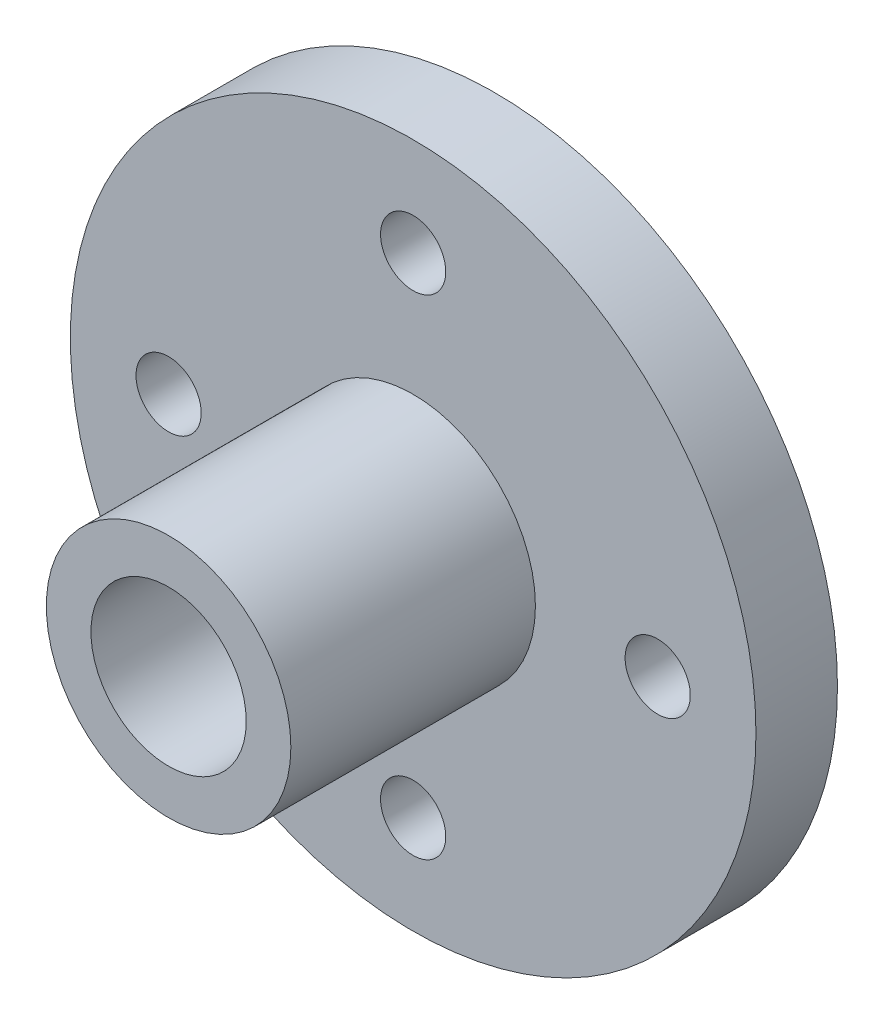
ISO-10303-21;
HEADER;
FILE_DESCRIPTION(('STEP AP214'),'2;1');
FILE_NAME('part.step','',(''),(''),'','','');
FILE_SCHEMA(('AUTOMOTIVE_DESIGN { 1 0 10303 214 1 1 1 1 }'));
ENDSEC;
DATA;
#1=APPLICATION_CONTEXT('core data for automotive mechanical design processes');
#2=APPLICATION_PROTOCOL_DEFINITION('international standard','automotive_design',2000,#1);
#3=PRODUCT_CONTEXT('',#1,'mechanical');
#4=PRODUCT('Part','Part','',(#3));
#5=PRODUCT_RELATED_PRODUCT_CATEGORY('part','',(#4));
#6=PRODUCT_DEFINITION_FORMATION('','',#4);
#7=PRODUCT_DEFINITION_CONTEXT('part definition',#1,'design');
#8=PRODUCT_DEFINITION('design','',#6,#7);
#9=PRODUCT_DEFINITION_SHAPE('','',#8);
#10=(LENGTH_UNIT() NAMED_UNIT(*) SI_UNIT(.MILLI.,.METRE.));
#11=(NAMED_UNIT(*) PLANE_ANGLE_UNIT() SI_UNIT($,.RADIAN.));
#12=(NAMED_UNIT(*) SI_UNIT($,.STERADIAN.) SOLID_ANGLE_UNIT());
#13=UNCERTAINTY_MEASURE_WITH_UNIT(LENGTH_MEASURE(1.E-05),#10,'distance_accuracy_value','');
#14=(GEOMETRIC_REPRESENTATION_CONTEXT(3) GLOBAL_UNCERTAINTY_ASSIGNED_CONTEXT((#13)) GLOBAL_UNIT_ASSIGNED_CONTEXT((#10,
#11,#12)) REPRESENTATION_CONTEXT('',''));
#15=CARTESIAN_POINT('',(0.,0.,0.));
#16=DIRECTION('',(0.,0.,1.));
#17=DIRECTION('',(1.,0.,0.));
#18=AXIS2_PLACEMENT_3D('',#15,#16,#17);
#19=CARTESIAN_POINT('',(0.,0.,5.));
#20=DIRECTION('',(0.,0.,1.));
#21=DIRECTION('',(1.,0.,0.));
#22=AXIS2_PLACEMENT_3D('',#19,#20,#21);
#23=PLANE('',#22);
#24=CARTESIAN_POINT('',(0.,0.,5.));
#25=DIRECTION('',(0.,0.,1.));
#26=DIRECTION('',(1.,0.,0.));
#27=AXIS2_PLACEMENT_3D('',#24,#25,#26);
#28=CIRCLE('',#27,15.);
#29=CARTESIAN_POINT('',(15.,0.,5.));
#30=VERTEX_POINT('',#29);
#31=EDGE_CURVE('E88',#30,#30,#28,.T.);
#32=ORIENTED_EDGE('',*,*,#31,.F.);
#33=EDGE_LOOP('',(#32));
#34=FACE_BOUND('',#33,.T.);
#35=CARTESIAN_POINT('',(0.,-30.,5.));
#36=DIRECTION('',(0.,0.,1.));
#37=DIRECTION('',(-1.,0.,0.));
#38=AXIS2_PLACEMENT_3D('',#35,#36,#37);
#39=CIRCLE('',#38,3.99999999999995);
#40=CARTESIAN_POINT('',(-3.99999999999994,-30.,5.));
#41=VERTEX_POINT('',#40);
#42=EDGE_CURVE('E68',#41,#41,#39,.T.);
#43=ORIENTED_EDGE('',*,*,#42,.F.);
#44=EDGE_LOOP('',(#43));
#45=FACE_BOUND('',#44,.T.);
#46=CARTESIAN_POINT('',(0.,30.,5.));
#47=DIRECTION('',(0.,0.,1.));
#48=DIRECTION('',(1.,0.,0.));
#49=AXIS2_PLACEMENT_3D('',#46,#47,#48);
#50=CIRCLE('',#49,4.);
#51=CARTESIAN_POINT('',(4.00000000000001,30.,5.));
#52=VERTEX_POINT('',#51);
#53=EDGE_CURVE('E55',#52,#52,#50,.T.);
#54=ORIENTED_EDGE('',*,*,#53,.F.);
#55=EDGE_LOOP('',(#54));
#56=FACE_BOUND('',#55,.T.);
#57=CARTESIAN_POINT('',(0.,0.,5.));
#58=DIRECTION('',(0.,0.,1.));
#59=DIRECTION('',(1.,0.,0.));
#60=AXIS2_PLACEMENT_3D('',#57,#58,#59);
#61=CIRCLE('',#60,42.055);
#62=CARTESIAN_POINT('',(42.055,0.,5.));
#63=VERTEX_POINT('',#62);
#64=EDGE_CURVE('E10',#63,#63,#61,.T.);
#65=ORIENTED_EDGE('',*,*,#64,.T.);
#66=EDGE_LOOP('',(#65));
#67=FACE_BOUND('',#66,.T.);
#68=CARTESIAN_POINT('',(-30.,0.,5.));
#69=DIRECTION('',(0.,0.,1.));
#70=DIRECTION('',(1.,0.,0.));
#71=AXIS2_PLACEMENT_3D('',#68,#69,#70);
#72=CIRCLE('',#71,4.);
#73=CARTESIAN_POINT('',(-26.,0.,5.));
#74=VERTEX_POINT('',#73);
#75=EDGE_CURVE('E60',#74,#74,#72,.T.);
#76=ORIENTED_EDGE('',*,*,#75,.F.);
#77=EDGE_LOOP('',(#76));
#78=FACE_BOUND('',#77,.T.);
#79=CARTESIAN_POINT('',(30.,0.,5.));
#80=DIRECTION('',(0.,0.,1.));
#81=DIRECTION('',(-1.,0.,0.));
#82=AXIS2_PLACEMENT_3D('',#79,#80,#81);
#83=CIRCLE('',#82,4.);
#84=CARTESIAN_POINT('',(26.,0.,5.));
#85=VERTEX_POINT('',#84);
#86=EDGE_CURVE('E76',#85,#85,#83,.T.);
#87=ORIENTED_EDGE('',*,*,#86,.F.);
#88=EDGE_LOOP('',(#87));
#89=FACE_BOUND('',#88,.T.);
#90=ADVANCED_FACE('F37',(#34,#45,#56,#67,#78,#89),#23,.T.);
#91=CARTESIAN_POINT('',(0.,0.,-5.));
#92=DIRECTION('',(0.,0.,1.));
#93=DIRECTION('',(1.,0.,0.));
#94=AXIS2_PLACEMENT_3D('',#91,#92,#93);
#95=PLANE('',#94);
#96=CARTESIAN_POINT('',(0.,0.,-5.));
#97=DIRECTION('',(0.,0.,1.));
#98=DIRECTION('',(1.,0.,0.));
#99=AXIS2_PLACEMENT_3D('',#96,#97,#98);
#100=CIRCLE('',#99,42.055);
#101=CARTESIAN_POINT('',(42.055,0.,-5.));
#102=VERTEX_POINT('',#101);
#103=EDGE_CURVE('E41',#102,#102,#100,.T.);
#104=ORIENTED_EDGE('',*,*,#103,.F.);
#105=EDGE_LOOP('',(#104));
#106=FACE_BOUND('',#105,.T.);
#107=CARTESIAN_POINT('',(0.,0.,-5.));
#108=DIRECTION('',(0.,0.,1.));
#109=DIRECTION('',(1.,0.,0.));
#110=AXIS2_PLACEMENT_3D('',#107,#108,#109);
#111=CIRCLE('',#110,9.525);
#112=CARTESIAN_POINT('',(9.525,0.,-5.));
#113=VERTEX_POINT('',#112);
#114=EDGE_CURVE('E50',#113,#113,#111,.T.);
#115=ORIENTED_EDGE('',*,*,#114,.T.);
#116=EDGE_LOOP('',(#115));
#117=FACE_BOUND('',#116,.T.);
#118=CARTESIAN_POINT('',(0.,30.,-5.));
#119=DIRECTION('',(0.,0.,1.));
#120=DIRECTION('',(1.,0.,0.));
#121=AXIS2_PLACEMENT_3D('',#118,#119,#120);
#122=CIRCLE('',#121,4.);
#123=CARTESIAN_POINT('',(4.00000000000001,30.,-5.));
#124=VERTEX_POINT('',#123);
#125=EDGE_CURVE('E56',#124,#124,#122,.T.);
#126=ORIENTED_EDGE('',*,*,#125,.T.);
#127=EDGE_LOOP('',(#126));
#128=FACE_BOUND('',#127,.T.);
#129=CARTESIAN_POINT('',(-30.,0.,-5.));
#130=DIRECTION('',(0.,0.,1.));
#131=DIRECTION('',(1.,0.,0.));
#132=AXIS2_PLACEMENT_3D('',#129,#130,#131);
#133=CIRCLE('',#132,4.);
#134=CARTESIAN_POINT('',(-26.,0.,-5.));
#135=VERTEX_POINT('',#134);
#136=EDGE_CURVE('E64',#135,#135,#133,.T.);
#137=ORIENTED_EDGE('',*,*,#136,.T.);
#138=EDGE_LOOP('',(#137));
#139=FACE_BOUND('',#138,.T.);
#140=CARTESIAN_POINT('',(0.,-30.,-5.));
#141=DIRECTION('',(0.,0.,1.));
#142=DIRECTION('',(-1.,0.,0.));
#143=AXIS2_PLACEMENT_3D('',#140,#141,#142);
#144=CIRCLE('',#143,3.99999999999995);
#145=CARTESIAN_POINT('',(-3.99999999999994,-30.,-5.));
#146=VERTEX_POINT('',#145);
#147=EDGE_CURVE('E72',#146,#146,#144,.T.);
#148=ORIENTED_EDGE('',*,*,#147,.T.);
#149=EDGE_LOOP('',(#148));
#150=FACE_BOUND('',#149,.T.);
#151=CARTESIAN_POINT('',(30.,0.,-5.));
#152=DIRECTION('',(0.,0.,1.));
#153=DIRECTION('',(-1.,0.,0.));
#154=AXIS2_PLACEMENT_3D('',#151,#152,#153);
#155=CIRCLE('',#154,4.);
#156=CARTESIAN_POINT('',(26.,0.,-5.));
#157=VERTEX_POINT('',#156);
#158=EDGE_CURVE('E80',#157,#157,#155,.T.);
#159=ORIENTED_EDGE('',*,*,#158,.T.);
#160=EDGE_LOOP('',(#159));
#161=FACE_BOUND('',#160,.T.);
#162=ADVANCED_FACE('F117',(#106,#117,#128,#139,#150,#161),#95,.F.);
#163=CARTESIAN_POINT('',(0.,0.,5.));
#164=DIRECTION('',(0.,0.,-1.));
#165=DIRECTION('',(-1.,0.,0.));
#166=AXIS2_PLACEMENT_3D('',#163,#164,#165);
#167=CYLINDRICAL_SURFACE('',#166,42.055);
#168=ORIENTED_EDGE('',*,*,#64,.F.);
#169=EDGE_LOOP('',(#168));
#170=FACE_BOUND('',#169,.T.);
#171=ORIENTED_EDGE('',*,*,#103,.T.);
#172=EDGE_LOOP('',(#171));
#173=FACE_BOUND('',#172,.T.);
#174=ADVANCED_FACE('F39',(#170,#173),#167,.T.);
#175=CARTESIAN_POINT('',(0.,0.,5.));
#176=DIRECTION('',(0.,0.,-1.));
#177=DIRECTION('',(-1.,0.,0.));
#178=AXIS2_PLACEMENT_3D('',#175,#176,#177);
#179=CYLINDRICAL_SURFACE('',#178,9.525);
#180=ORIENTED_EDGE('',*,*,#114,.F.);
#181=EDGE_LOOP('',(#180));
#182=FACE_BOUND('',#181,.T.);
#183=CARTESIAN_POINT('',(0.,0.,35.));
#184=DIRECTION('',(0.,0.,1.));
#185=DIRECTION('',(1.,0.,0.));
#186=AXIS2_PLACEMENT_3D('',#183,#184,#185);
#187=CIRCLE('',#186,9.525);
#188=CARTESIAN_POINT('',(9.525,0.,35.));
#189=VERTEX_POINT('',#188);
#190=EDGE_CURVE('E92',#189,#189,#187,.T.);
#191=ORIENTED_EDGE('',*,*,#190,.T.);
#192=EDGE_LOOP('',(#191));
#193=FACE_BOUND('',#192,.T.);
#194=ADVANCED_FACE('F100',(#182,#193),#179,.F.);
#195=CARTESIAN_POINT('',(0.,30.,5.));
#196=DIRECTION('',(0.,0.,-1.));
#197=DIRECTION('',(-1.,0.,0.));
#198=AXIS2_PLACEMENT_3D('',#195,#196,#197);
#199=CYLINDRICAL_SURFACE('',#198,4.);
#200=ORIENTED_EDGE('',*,*,#53,.T.);
#201=EDGE_LOOP('',(#200));
#202=FACE_BOUND('',#201,.T.);
#203=ORIENTED_EDGE('',*,*,#125,.F.);
#204=EDGE_LOOP('',(#203));
#205=FACE_BOUND('',#204,.T.);
#206=ADVANCED_FACE('F144',(#202,#205),#199,.F.);
#207=CARTESIAN_POINT('',(-30.,0.,5.));
#208=DIRECTION('',(0.,0.,-1.));
#209=DIRECTION('',(-1.,0.,0.));
#210=AXIS2_PLACEMENT_3D('',#207,#208,#209);
#211=CYLINDRICAL_SURFACE('',#210,4.);
#212=ORIENTED_EDGE('',*,*,#75,.T.);
#213=EDGE_LOOP('',(#212));
#214=FACE_BOUND('',#213,.T.);
#215=ORIENTED_EDGE('',*,*,#136,.F.);
#216=EDGE_LOOP('',(#215));
#217=FACE_BOUND('',#216,.T.);
#218=ADVANCED_FACE('F148',(#214,#217),#211,.F.);
#219=CARTESIAN_POINT('',(0.,-30.,5.));
#220=DIRECTION('',(0.,0.,-1.));
#221=DIRECTION('',(-1.,0.,0.));
#222=AXIS2_PLACEMENT_3D('',#219,#220,#221);
#223=CYLINDRICAL_SURFACE('',#222,3.99999999999995);
#224=ORIENTED_EDGE('',*,*,#42,.T.);
#225=EDGE_LOOP('',(#224));
#226=FACE_BOUND('',#225,.T.);
#227=ORIENTED_EDGE('',*,*,#147,.F.);
#228=EDGE_LOOP('',(#227));
#229=FACE_BOUND('',#228,.T.);
#230=ADVANCED_FACE('F129',(#226,#229),#223,.F.);
#231=CARTESIAN_POINT('',(30.,0.,5.));
#232=DIRECTION('',(0.,0.,-1.));
#233=DIRECTION('',(-1.,0.,0.));
#234=AXIS2_PLACEMENT_3D('',#231,#232,#233);
#235=CYLINDRICAL_SURFACE('',#234,4.);
#236=ORIENTED_EDGE('',*,*,#86,.T.);
#237=EDGE_LOOP('',(#236));
#238=FACE_BOUND('',#237,.T.);
#239=ORIENTED_EDGE('',*,*,#158,.F.);
#240=EDGE_LOOP('',(#239));
#241=FACE_BOUND('',#240,.T.);
#242=ADVANCED_FACE('F111',(#238,#241),#235,.F.);
#243=CARTESIAN_POINT('',(0.,0.,35.));
#244=DIRECTION('',(0.,0.,-1.));
#245=DIRECTION('',(-1.,0.,0.));
#246=AXIS2_PLACEMENT_3D('',#243,#244,#245);
#247=CYLINDRICAL_SURFACE('',#246,15.);
#248=CARTESIAN_POINT('',(0.,0.,35.));
#249=DIRECTION('',(0.,0.,1.));
#250=DIRECTION('',(1.,0.,0.));
#251=AXIS2_PLACEMENT_3D('',#248,#249,#250);
#252=CIRCLE('',#251,15.);
#253=CARTESIAN_POINT('',(15.,0.,35.));
#254=VERTEX_POINT('',#253);
#255=EDGE_CURVE('E84',#254,#254,#252,.T.);
#256=ORIENTED_EDGE('',*,*,#255,.F.);
#257=EDGE_LOOP('',(#256));
#258=FACE_BOUND('',#257,.T.);
#259=ORIENTED_EDGE('',*,*,#31,.T.);
#260=EDGE_LOOP('',(#259));
#261=FACE_BOUND('',#260,.T.);
#262=ADVANCED_FACE('F105',(#258,#261),#247,.T.);
#263=CARTESIAN_POINT('',(0.,0.,35.));
#264=DIRECTION('',(0.,0.,1.));
#265=DIRECTION('',(1.,0.,0.));
#266=AXIS2_PLACEMENT_3D('',#263,#264,#265);
#267=PLANE('',#266);
#268=ORIENTED_EDGE('',*,*,#190,.F.);
#269=EDGE_LOOP('',(#268));
#270=FACE_BOUND('',#269,.T.);
#271=ORIENTED_EDGE('',*,*,#255,.T.);
#272=EDGE_LOOP('',(#271));
#273=FACE_BOUND('',#272,.T.);
#274=ADVANCED_FACE('F102',(#270,#273),#267,.T.);
#275=CLOSED_SHELL('',(#90,#162,#174,#194,#206,#218,#230,#242,#262,#274));
#276=MANIFOLD_SOLID_BREP('B2',#275);
#277=ADVANCED_BREP_SHAPE_REPRESENTATION('',(#18,#276),#14);
#278=SHAPE_DEFINITION_REPRESENTATION(#9,#277);
ENDSEC;
END-ISO-10303-21;
